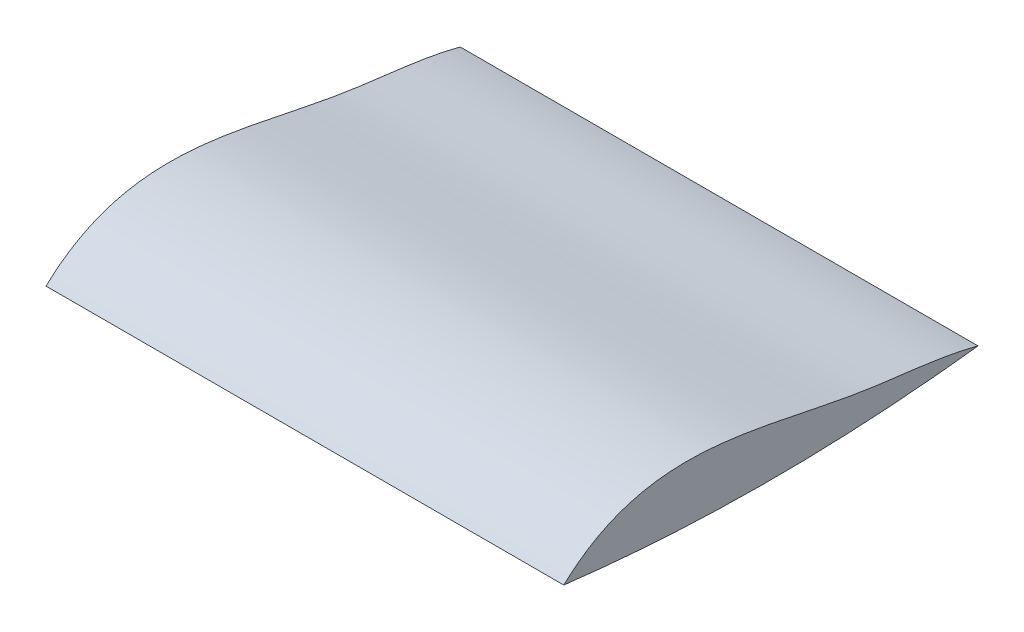
ISO-10303-21;
HEADER;
FILE_DESCRIPTION(('STEP AP214'),'2;1');
FILE_NAME('part.step','',(''),(''),'','','');
FILE_SCHEMA(('AUTOMOTIVE_DESIGN { 1 0 10303 214 1 1 1 1 }'));
ENDSEC;
DATA;
#1=APPLICATION_CONTEXT('core data for automotive mechanical design processes');
#2=APPLICATION_PROTOCOL_DEFINITION('international standard','automotive_design',2000,#1);
#3=PRODUCT_CONTEXT('',#1,'mechanical');
#4=PRODUCT('Part','Part','',(#3));
#5=PRODUCT_RELATED_PRODUCT_CATEGORY('part','',(#4));
#6=PRODUCT_DEFINITION_FORMATION('','',#4);
#7=PRODUCT_DEFINITION_CONTEXT('part definition',#1,'design');
#8=PRODUCT_DEFINITION('design','',#6,#7);
#9=PRODUCT_DEFINITION_SHAPE('','',#8);
#10=(LENGTH_UNIT() NAMED_UNIT(*) SI_UNIT(.MILLI.,.METRE.));
#11=(NAMED_UNIT(*) PLANE_ANGLE_UNIT() SI_UNIT($,.RADIAN.));
#12=(NAMED_UNIT(*) SI_UNIT($,.STERADIAN.) SOLID_ANGLE_UNIT());
#13=UNCERTAINTY_MEASURE_WITH_UNIT(LENGTH_MEASURE(1.E-05),#10,'distance_accuracy_value','');
#14=(GEOMETRIC_REPRESENTATION_CONTEXT(3) GLOBAL_UNCERTAINTY_ASSIGNED_CONTEXT((#13)) GLOBAL_UNIT_ASSIGNED_CONTEXT((#10,
#11,#12)) REPRESENTATION_CONTEXT('',''));
#15=CARTESIAN_POINT('',(0.,0.,0.));
#16=DIRECTION('',(0.,0.,1.));
#17=DIRECTION('',(1.,0.,0.));
#18=AXIS2_PLACEMENT_3D('',#15,#16,#17);
#19=CARTESIAN_POINT('',(0.,-19.000759592895,-209.861011224746));
#20=DIRECTION('',(-1.,0.,0.));
#21=DIRECTION('',(0.,0.,1.));
#22=AXIS2_PLACEMENT_3D('',#19,#20,#21);
#23=PLANE('',#22);
#24=CARTESIAN_POINT('',(0.,-3.6750964557679,43.7009764592046));
#25=CARTESIAN_POINT('',(0.,-34.326422730022,-209.422998908696));
#26=CARTESIAN_POINT('',(0.,-3.6750964557679,-464.299023540795));
#27=B_SPLINE_CURVE_WITH_KNOTS('',2,(#24,#25,#26),.UNSPECIFIED.,.F.,.F.,(3,3),(0.,1.),.UNSPECIFIED.);
#28=CARTESIAN_POINT('',(0.,-3.6750964557679,43.7009764592046));
#29=VERTEX_POINT('',#28);
#30=CARTESIAN_POINT('',(0.,-3.6750964557679,-464.299023540795));
#31=VERTEX_POINT('',#30);
#32=EDGE_CURVE('E60',#29,#31,#27,.T.);
#33=ORIENTED_EDGE('',*,*,#32,.T.);
#34=CARTESIAN_POINT('',(0.,-3.6750964557679,-464.299023540795));
#35=CARTESIAN_POINT('',(0.,8.74078390062267,-417.69942723074));
#36=CARTESIAN_POINT('',(0.,18.2596920768661,-246.664616315625));
#37=CARTESIAN_POINT('',(0.,93.5576710370726,-60.093960524119));
#38=CARTESIAN_POINT('',(0.,-3.6750964557679,43.7009764592046));
#39=B_SPLINE_CURVE_WITH_KNOTS('',3,(#34,#35,#36,#37,#38),.UNSPECIFIED.,.F.,.F.,(4,1,4),(0.,
0.273223185439462,1.),.UNSPECIFIED.);
#40=EDGE_CURVE('E65',#31,#29,#39,.T.);
#41=ORIENTED_EDGE('',*,*,#40,.T.);
#42=EDGE_LOOP('',(#33,#41));
#43=FACE_BOUND('',#42,.T.);
#44=ADVANCED_FACE('F32',(#43),#23,.F.);
#45=CARTESIAN_POINT('',(-635.,-19.000759592895,-209.861011224748));
#46=DIRECTION('',(-1.,0.,0.));
#47=DIRECTION('',(0.,0.,1.));
#48=AXIS2_PLACEMENT_3D('',#45,#46,#47);
#49=PLANE('',#48);
#50=CARTESIAN_POINT('',(-635.,-3.6750964557679,43.7009764592024));
#51=CARTESIAN_POINT('',(-635.,-34.326422730022,-209.422998908698));
#52=CARTESIAN_POINT('',(-635.,-3.6750964557679,-464.299023540798));
#53=B_SPLINE_CURVE_WITH_KNOTS('',2,(#50,#51,#52),.UNSPECIFIED.,.F.,.F.,(3,3),(0.,1.),.UNSPECIFIED.);
#54=CARTESIAN_POINT('',(-635.,-3.6750964557679,43.7009764592024));
#55=VERTEX_POINT('',#54);
#56=CARTESIAN_POINT('',(-635.,-3.6750964557679,-464.299023540798));
#57=VERTEX_POINT('',#56);
#58=EDGE_CURVE('E48',#55,#57,#53,.T.);
#59=ORIENTED_EDGE('',*,*,#58,.F.);
#60=CARTESIAN_POINT('',(-635.,-3.6750964557679,-464.299023540798));
#61=CARTESIAN_POINT('',(-635.,8.74078390062267,-417.699427230742));
#62=CARTESIAN_POINT('',(-635.,18.2596920768661,-246.664616315627));
#63=CARTESIAN_POINT('',(-635.,93.5576710370726,-60.0939605241212));
#64=CARTESIAN_POINT('',(-635.,-3.6750964557679,43.7009764592024));
#65=B_SPLINE_CURVE_WITH_KNOTS('',3,(#60,#61,#62,#63,#64),.UNSPECIFIED.,.F.,.F.,(4,1,4),(0.,
0.273223185439462,1.),.UNSPECIFIED.);
#66=EDGE_CURVE('E11',#57,#55,#65,.T.);
#67=ORIENTED_EDGE('',*,*,#66,.F.);
#68=EDGE_LOOP('',(#59,#67));
#69=FACE_BOUND('',#68,.T.);
#70=ADVANCED_FACE('F91',(#69),#49,.T.);
#71=CARTESIAN_POINT('',(0.,-3.6750964557679,43.7009764592046));
#72=CARTESIAN_POINT('',(-635.,-3.6750964557679,43.7009764592024));
#73=CARTESIAN_POINT('',(0.,-34.326422730022,-209.422998908696));
#74=CARTESIAN_POINT('',(-635.,-34.326422730022,-209.422998908698));
#75=CARTESIAN_POINT('',(0.,-3.6750964557679,-464.299023540795));
#76=CARTESIAN_POINT('',(-635.,-3.6750964557679,-464.299023540798));
#77=B_SPLINE_SURFACE_WITH_KNOTS('',2,1,((#71,#72),(#73,#74),(#75,#76)),.UNSPECIFIED.,.F.,.F.,
.F.,(3,3),(2,2),(0.,1.),(0.,1.),.UNSPECIFIED.);
#78=DIRECTION('',(-1.,0.,0.));
#79=VECTOR('',#78,1.);
#80=CARTESIAN_POINT('',(0.,-3.6750964557679,-464.299023540795));
#81=LINE('',#80,#79);
#82=EDGE_CURVE('E41',#31,#57,#81,.T.);
#83=DIRECTION('',(-1.,0.,0.));
#84=VECTOR('',#83,1.);
#85=CARTESIAN_POINT('',(0.,-3.6750964557679,43.7009764592046));
#86=LINE('',#85,#84);
#87=EDGE_CURVE('E63',#29,#55,#86,.T.);
#88=ORIENTED_EDGE('',*,*,#82,.F.);
#89=ORIENTED_EDGE('',*,*,#32,.F.);
#90=ORIENTED_EDGE('',*,*,#87,.T.);
#91=ORIENTED_EDGE('',*,*,#58,.T.);
#92=EDGE_LOOP('',(#88,#89,#90,#91));
#93=FACE_BOUND('',#92,.T.);
#94=ADVANCED_FACE('F62',(#93),#77,.F.);
#95=CARTESIAN_POINT('',(0.,-3.6750964557679,-464.299023540795));
#96=CARTESIAN_POINT('',(-635.,-3.6750964557679,-464.299023540798));
#97=CARTESIAN_POINT('',(0.,8.74078390062267,-417.69942723074));
#98=CARTESIAN_POINT('',(-635.,8.74078390062267,-417.699427230742));
#99=CARTESIAN_POINT('',(0.,18.2596920768661,-246.664616315625));
#100=CARTESIAN_POINT('',(-635.,18.2596920768661,-246.664616315627));
#101=CARTESIAN_POINT('',(0.,93.5576710370726,-60.093960524119));
#102=CARTESIAN_POINT('',(-635.,93.5576710370726,-60.0939605241212));
#103=CARTESIAN_POINT('',(0.,-3.6750964557679,43.7009764592046));
#104=CARTESIAN_POINT('',(-635.,-3.6750964557679,43.7009764592024));
#105=B_SPLINE_SURFACE_WITH_KNOTS('',3,1,((#95,#96),(#97,#98),(#99,#100),(#101,#102),(#103,
#104)),.UNSPECIFIED.,.F.,.F.,.F.,(4,1,4),(2,2),(0.,0.273223185439462,1.),(0.,1.),.UNSPECIFIED.);
#106=ORIENTED_EDGE('',*,*,#66,.T.);
#107=ORIENTED_EDGE('',*,*,#87,.F.);
#108=ORIENTED_EDGE('',*,*,#40,.F.);
#109=ORIENTED_EDGE('',*,*,#82,.T.);
#110=EDGE_LOOP('',(#106,#107,#108,#109));
#111=FACE_BOUND('',#110,.T.);
#112=ADVANCED_FACE('F67',(#111),#105,.F.);
#113=CLOSED_SHELL('',(#44,#70,#94,#112));
#114=MANIFOLD_SOLID_BREP('B2',#113);
#115=ADVANCED_BREP_SHAPE_REPRESENTATION('',(#18,#114),#14);
#116=SHAPE_DEFINITION_REPRESENTATION(#9,#115);
ENDSEC;
END-ISO-10303-21;
